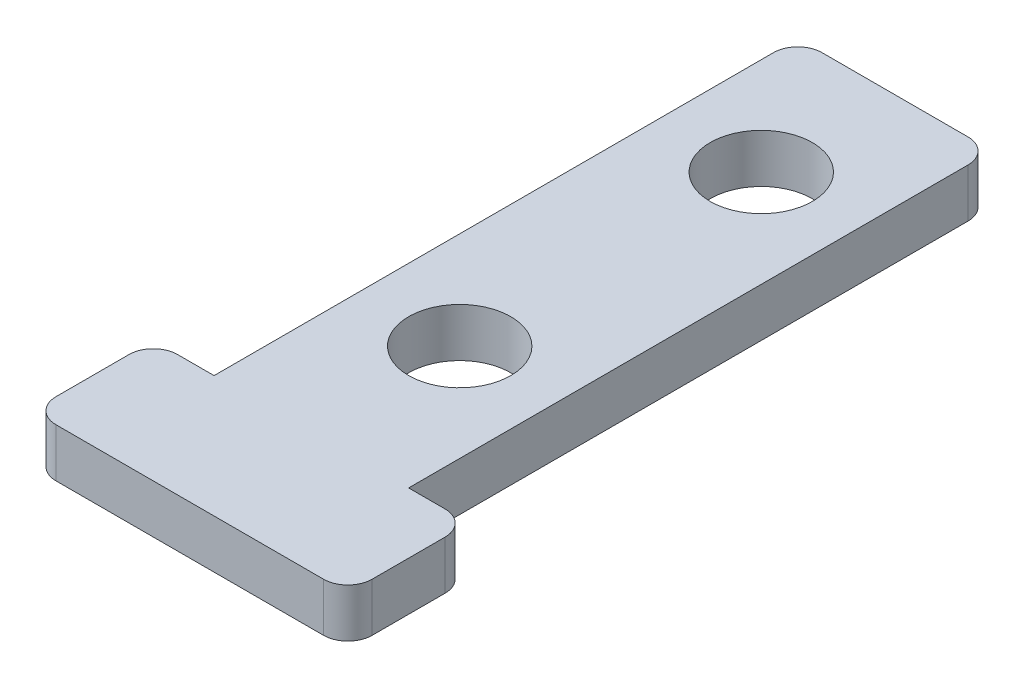
ISO-10303-21;
HEADER;
FILE_DESCRIPTION(('STEP AP214'),'2;1');
FILE_NAME('part.step','',(''),(''),'','','');
FILE_SCHEMA(('AUTOMOTIVE_DESIGN { 1 0 10303 214 1 1 1 1 }'));
ENDSEC;
DATA;
#1=APPLICATION_CONTEXT('core data for automotive mechanical design processes');
#2=APPLICATION_PROTOCOL_DEFINITION('international standard','automotive_design',2000,#1);
#3=PRODUCT_CONTEXT('',#1,'mechanical');
#4=PRODUCT('Part','Part','',(#3));
#5=PRODUCT_RELATED_PRODUCT_CATEGORY('part','',(#4));
#6=PRODUCT_DEFINITION_FORMATION('','',#4);
#7=PRODUCT_DEFINITION_CONTEXT('part definition',#1,'design');
#8=PRODUCT_DEFINITION('design','',#6,#7);
#9=PRODUCT_DEFINITION_SHAPE('','',#8);
#10=(LENGTH_UNIT() NAMED_UNIT(*) SI_UNIT(.MILLI.,.METRE.));
#11=(NAMED_UNIT(*) PLANE_ANGLE_UNIT() SI_UNIT($,.RADIAN.));
#12=(NAMED_UNIT(*) SI_UNIT($,.STERADIAN.) SOLID_ANGLE_UNIT());
#13=UNCERTAINTY_MEASURE_WITH_UNIT(LENGTH_MEASURE(1.E-05),#10,'distance_accuracy_value','');
#14=(GEOMETRIC_REPRESENTATION_CONTEXT(3) GLOBAL_UNCERTAINTY_ASSIGNED_CONTEXT((#13)) GLOBAL_UNIT_ASSIGNED_CONTEXT((#10,
#11,#12)) REPRESENTATION_CONTEXT('',''));
#15=CARTESIAN_POINT('',(0.,0.,0.));
#16=DIRECTION('',(0.,0.,1.));
#17=DIRECTION('',(1.,0.,0.));
#18=AXIS2_PLACEMENT_3D('',#15,#16,#17);
#19=CARTESIAN_POINT('',(0.,2.,0.));
#20=DIRECTION('',(0.,1.,0.));
#21=DIRECTION('',(0.,0.,1.));
#22=AXIS2_PLACEMENT_3D('',#19,#20,#21);
#23=PLANE('',#22);
#24=CARTESIAN_POINT('',(0.,2.,-23.5));
#25=DIRECTION('',(0.,1.,0.));
#26=DIRECTION('',(0.,0.,1.));
#27=AXIS2_PLACEMENT_3D('',#24,#25,#26);
#28=CIRCLE('',#27,2.1);
#29=CARTESIAN_POINT('',(0.,2.,-21.4));
#30=VERTEX_POINT('',#29);
#31=EDGE_CURVE('E229',#30,#30,#28,.T.);
#32=ORIENTED_EDGE('',*,*,#31,.F.);
#33=EDGE_LOOP('',(#32));
#34=FACE_BOUND('',#33,.T.);
#35=DIRECTION('',(0.,0.,-1.));
#36=VECTOR('',#35,1.);
#37=CARTESIAN_POINT('',(4.,2.,-5.));
#38=LINE('',#37,#36);
#39=CARTESIAN_POINT('',(4.,2.,-5.));
#40=VERTEX_POINT('',#39);
#41=CARTESIAN_POINT('',(4.,2.,-28.));
#42=VERTEX_POINT('',#41);
#43=EDGE_CURVE('E187',#40,#42,#38,.T.);
#44=ORIENTED_EDGE('',*,*,#43,.T.);
#45=CARTESIAN_POINT('',(3.,2.,-28.));
#46=DIRECTION('',(0.,1.,0.));
#47=DIRECTION('',(0.,0.,1.));
#48=AXIS2_PLACEMENT_3D('',#45,#46,#47);
#49=CIRCLE('',#48,1.);
#50=CARTESIAN_POINT('',(3.,2.,-29.));
#51=VERTEX_POINT('',#50);
#52=EDGE_CURVE('E12',#42,#51,#49,.T.);
#53=ORIENTED_EDGE('',*,*,#52,.T.);
#54=DIRECTION('',(-1.,0.,0.));
#55=VECTOR('',#54,1.);
#56=CARTESIAN_POINT('',(-4.,2.,-29.));
#57=LINE('',#56,#55);
#58=CARTESIAN_POINT('',(-3.,2.,-29.));
#59=VERTEX_POINT('',#58);
#60=EDGE_CURVE('E209',#51,#59,#57,.T.);
#61=ORIENTED_EDGE('',*,*,#60,.T.);
#62=CARTESIAN_POINT('',(-3.,2.,-28.));
#63=DIRECTION('',(0.,1.,0.));
#64=DIRECTION('',(0.,0.,1.));
#65=AXIS2_PLACEMENT_3D('',#62,#63,#64);
#66=CIRCLE('',#65,1.);
#67=CARTESIAN_POINT('',(-4.,2.,-28.));
#68=VERTEX_POINT('',#67);
#69=EDGE_CURVE('E316',#59,#68,#66,.T.);
#70=ORIENTED_EDGE('',*,*,#69,.T.);
#71=DIRECTION('',(0.,0.,1.));
#72=VECTOR('',#71,1.);
#73=CARTESIAN_POINT('',(-4.,2.,-5.));
#74=LINE('',#73,#72);
#75=CARTESIAN_POINT('',(-4.,2.,-5.));
#76=VERTEX_POINT('',#75);
#77=EDGE_CURVE('E214',#68,#76,#74,.T.);
#78=ORIENTED_EDGE('',*,*,#77,.T.);
#79=DIRECTION('',(-1.,0.,0.));
#80=VECTOR('',#79,1.);
#81=CARTESIAN_POINT('',(-6.5,2.,-5.));
#82=LINE('',#81,#80);
#83=CARTESIAN_POINT('',(-5.5,2.,-5.));
#84=VERTEX_POINT('',#83);
#85=EDGE_CURVE('E303',#76,#84,#82,.T.);
#86=ORIENTED_EDGE('',*,*,#85,.T.);
#87=CARTESIAN_POINT('',(-5.5,2.,-4.));
#88=DIRECTION('',(0.,1.,0.));
#89=DIRECTION('',(0.,0.,1.));
#90=AXIS2_PLACEMENT_3D('',#87,#88,#89);
#91=CIRCLE('',#90,1.);
#92=CARTESIAN_POINT('',(-6.5,2.,-4.));
#93=VERTEX_POINT('',#92);
#94=EDGE_CURVE('E331',#84,#93,#91,.T.);
#95=ORIENTED_EDGE('',*,*,#94,.T.);
#96=DIRECTION('',(0.,0.,1.));
#97=VECTOR('',#96,1.);
#98=CARTESIAN_POINT('',(-6.5,2.,0.));
#99=LINE('',#98,#97);
#100=CARTESIAN_POINT('',(-6.5,2.,-1.));
#101=VERTEX_POINT('',#100);
#102=EDGE_CURVE('E276',#93,#101,#99,.T.);
#103=ORIENTED_EDGE('',*,*,#102,.T.);
#104=CARTESIAN_POINT('',(-5.5,2.,-1.));
#105=DIRECTION('',(0.,1.,0.));
#106=DIRECTION('',(0.,0.,1.));
#107=AXIS2_PLACEMENT_3D('',#104,#105,#106);
#108=CIRCLE('',#107,1.);
#109=CARTESIAN_POINT('',(-5.5,2.,0.));
#110=VERTEX_POINT('',#109);
#111=EDGE_CURVE('E359',#101,#110,#108,.T.);
#112=ORIENTED_EDGE('',*,*,#111,.T.);
#113=DIRECTION('',(1.,0.,0.));
#114=VECTOR('',#113,1.);
#115=CARTESIAN_POINT('',(-6.5,2.,0.));
#116=LINE('',#115,#114);
#117=CARTESIAN_POINT('',(5.5,2.,0.));
#118=VERTEX_POINT('',#117);
#119=EDGE_CURVE('E271',#110,#118,#116,.T.);
#120=ORIENTED_EDGE('',*,*,#119,.T.);
#121=CARTESIAN_POINT('',(5.5,2.,-1.));
#122=DIRECTION('',(0.,1.,0.));
#123=DIRECTION('',(0.,0.,1.));
#124=AXIS2_PLACEMENT_3D('',#121,#122,#123);
#125=CIRCLE('',#124,1.);
#126=CARTESIAN_POINT('',(6.5,2.,-1.));
#127=VERTEX_POINT('',#126);
#128=EDGE_CURVE('E375',#118,#127,#125,.T.);
#129=ORIENTED_EDGE('',*,*,#128,.T.);
#130=DIRECTION('',(0.,0.,-1.));
#131=VECTOR('',#130,1.);
#132=CARTESIAN_POINT('',(6.5,2.,0.));
#133=LINE('',#132,#131);
#134=CARTESIAN_POINT('',(6.5,2.,-4.));
#135=VERTEX_POINT('',#134);
#136=EDGE_CURVE('E196',#127,#135,#133,.T.);
#137=ORIENTED_EDGE('',*,*,#136,.T.);
#138=CARTESIAN_POINT('',(5.5,2.,-4.));
#139=DIRECTION('',(0.,1.,0.));
#140=DIRECTION('',(0.,0.,1.));
#141=AXIS2_PLACEMENT_3D('',#138,#139,#140);
#142=CIRCLE('',#141,1.);
#143=CARTESIAN_POINT('',(5.5,2.,-5.));
#144=VERTEX_POINT('',#143);
#145=EDGE_CURVE('E191',#135,#144,#142,.T.);
#146=ORIENTED_EDGE('',*,*,#145,.T.);
#147=DIRECTION('',(-1.,0.,0.));
#148=VECTOR('',#147,1.);
#149=CARTESIAN_POINT('',(6.5,2.,-5.));
#150=LINE('',#149,#148);
#151=EDGE_CURVE('E184',#144,#40,#150,.T.);
#152=ORIENTED_EDGE('',*,*,#151,.T.);
#153=EDGE_LOOP('',(#44,#53,#61,#70,#78,#86,#95,#103,#112,#120,#129,#137,#146,#152));
#154=FACE_BOUND('',#153,.T.);
#155=CARTESIAN_POINT('',(0.,2.,-11.1));
#156=DIRECTION('',(0.,1.,0.));
#157=DIRECTION('',(0.,0.,1.));
#158=AXIS2_PLACEMENT_3D('',#155,#156,#157);
#159=CIRCLE('',#158,2.1);
#160=CARTESIAN_POINT('',(0.,2.,-9.));
#161=VERTEX_POINT('',#160);
#162=EDGE_CURVE('E242',#161,#161,#159,.T.);
#163=ORIENTED_EDGE('',*,*,#162,.F.);
#164=EDGE_LOOP('',(#163));
#165=FACE_BOUND('',#164,.T.);
#166=ADVANCED_FACE('F53',(#34,#154,#165),#23,.T.);
#167=CARTESIAN_POINT('',(0.,0.,0.));
#168=DIRECTION('',(0.,1.,0.));
#169=DIRECTION('',(0.,0.,1.));
#170=AXIS2_PLACEMENT_3D('',#167,#168,#169);
#171=PLANE('',#170);
#172=DIRECTION('',(-1.,0.,0.));
#173=VECTOR('',#172,1.);
#174=CARTESIAN_POINT('',(-4.,0.,-29.));
#175=LINE('',#174,#173);
#176=CARTESIAN_POINT('',(3.,0.,-29.));
#177=VERTEX_POINT('',#176);
#178=CARTESIAN_POINT('',(-3.,0.,-29.));
#179=VERTEX_POINT('',#178);
#180=EDGE_CURVE('E292',#177,#179,#175,.T.);
#181=ORIENTED_EDGE('',*,*,#180,.F.);
#182=CARTESIAN_POINT('',(3.,0.,-28.));
#183=DIRECTION('',(0.,1.,0.));
#184=DIRECTION('',(0.,0.,1.));
#185=AXIS2_PLACEMENT_3D('',#182,#183,#184);
#186=CIRCLE('',#185,1.);
#187=CARTESIAN_POINT('',(4.,0.,-28.));
#188=VERTEX_POINT('',#187);
#189=EDGE_CURVE('E82',#177,#188,#186,.F.);
#190=ORIENTED_EDGE('',*,*,#189,.T.);
#191=DIRECTION('',(0.,0.,-1.));
#192=VECTOR('',#191,1.);
#193=CARTESIAN_POINT('',(4.,0.,-5.));
#194=LINE('',#193,#192);
#195=CARTESIAN_POINT('',(4.,0.,-5.));
#196=VERTEX_POINT('',#195);
#197=EDGE_CURVE('E502',#196,#188,#194,.T.);
#198=ORIENTED_EDGE('',*,*,#197,.F.);
#199=DIRECTION('',(-1.,0.,0.));
#200=VECTOR('',#199,1.);
#201=CARTESIAN_POINT('',(6.5,0.,-5.));
#202=LINE('',#201,#200);
#203=CARTESIAN_POINT('',(5.5,0.,-5.));
#204=VERTEX_POINT('',#203);
#205=EDGE_CURVE('E202',#204,#196,#202,.T.);
#206=ORIENTED_EDGE('',*,*,#205,.F.);
#207=CARTESIAN_POINT('',(5.5,0.,-4.));
#208=DIRECTION('',(0.,1.,0.));
#209=DIRECTION('',(0.,0.,1.));
#210=AXIS2_PLACEMENT_3D('',#207,#208,#209);
#211=CIRCLE('',#210,1.);
#212=CARTESIAN_POINT('',(6.5,0.,-4.));
#213=VERTEX_POINT('',#212);
#214=EDGE_CURVE('E374',#204,#213,#211,.F.);
#215=ORIENTED_EDGE('',*,*,#214,.T.);
#216=DIRECTION('',(0.,0.,-1.));
#217=VECTOR('',#216,1.);
#218=CARTESIAN_POINT('',(6.5,0.,0.));
#219=LINE('',#218,#217);
#220=CARTESIAN_POINT('',(6.5,0.,-1.));
#221=VERTEX_POINT('',#220);
#222=EDGE_CURVE('E234',#221,#213,#219,.T.);
#223=ORIENTED_EDGE('',*,*,#222,.F.);
#224=CARTESIAN_POINT('',(5.5,0.,-1.));
#225=DIRECTION('',(0.,1.,0.));
#226=DIRECTION('',(0.,0.,1.));
#227=AXIS2_PLACEMENT_3D('',#224,#225,#226);
#228=CIRCLE('',#227,1.);
#229=CARTESIAN_POINT('',(5.5,0.,0.));
#230=VERTEX_POINT('',#229);
#231=EDGE_CURVE('E413',#221,#230,#228,.F.);
#232=ORIENTED_EDGE('',*,*,#231,.T.);
#233=DIRECTION('',(1.,0.,0.));
#234=VECTOR('',#233,1.);
#235=CARTESIAN_POINT('',(-6.5,0.,0.));
#236=LINE('',#235,#234);
#237=CARTESIAN_POINT('',(-5.5,0.,0.));
#238=VERTEX_POINT('',#237);
#239=EDGE_CURVE('E245',#238,#230,#236,.T.);
#240=ORIENTED_EDGE('',*,*,#239,.F.);
#241=CARTESIAN_POINT('',(-5.5,0.,-1.));
#242=DIRECTION('',(0.,1.,0.));
#243=DIRECTION('',(0.,0.,1.));
#244=AXIS2_PLACEMENT_3D('',#241,#242,#243);
#245=CIRCLE('',#244,1.);
#246=CARTESIAN_POINT('',(-6.5,0.,-1.));
#247=VERTEX_POINT('',#246);
#248=EDGE_CURVE('E387',#238,#247,#245,.F.);
#249=ORIENTED_EDGE('',*,*,#248,.T.);
#250=DIRECTION('',(0.,0.,1.));
#251=VECTOR('',#250,1.);
#252=CARTESIAN_POINT('',(-6.5,0.,0.));
#253=LINE('',#252,#251);
#254=CARTESIAN_POINT('',(-6.5,0.,-4.));
#255=VERTEX_POINT('',#254);
#256=EDGE_CURVE('E250',#255,#247,#253,.T.);
#257=ORIENTED_EDGE('',*,*,#256,.F.);
#258=CARTESIAN_POINT('',(-5.5,0.,-4.));
#259=DIRECTION('',(0.,1.,0.));
#260=DIRECTION('',(0.,0.,1.));
#261=AXIS2_PLACEMENT_3D('',#258,#259,#260);
#262=CIRCLE('',#261,1.);
#263=CARTESIAN_POINT('',(-5.5,0.,-5.));
#264=VERTEX_POINT('',#263);
#265=EDGE_CURVE('E332',#255,#264,#262,.F.);
#266=ORIENTED_EDGE('',*,*,#265,.T.);
#267=DIRECTION('',(-1.,0.,0.));
#268=VECTOR('',#267,1.);
#269=CARTESIAN_POINT('',(-6.5,0.,-5.));
#270=LINE('',#269,#268);
#271=CARTESIAN_POINT('',(-4.,0.,-5.));
#272=VERTEX_POINT('',#271);
#273=EDGE_CURVE('E260',#272,#264,#270,.T.);
#274=ORIENTED_EDGE('',*,*,#273,.F.);
#275=DIRECTION('',(0.,0.,1.));
#276=VECTOR('',#275,1.);
#277=CARTESIAN_POINT('',(-4.,0.,-5.));
#278=LINE('',#277,#276);
#279=CARTESIAN_POINT('',(-4.,0.,-28.));
#280=VERTEX_POINT('',#279);
#281=EDGE_CURVE('E288',#280,#272,#278,.T.);
#282=ORIENTED_EDGE('',*,*,#281,.F.);
#283=CARTESIAN_POINT('',(-3.,0.,-28.));
#284=DIRECTION('',(0.,1.,0.));
#285=DIRECTION('',(0.,0.,1.));
#286=AXIS2_PLACEMENT_3D('',#283,#284,#285);
#287=CIRCLE('',#286,1.);
#288=EDGE_CURVE('E456',#280,#179,#287,.F.);
#289=ORIENTED_EDGE('',*,*,#288,.T.);
#290=EDGE_LOOP('',(#181,#190,#198,#206,#215,#223,#232,#240,#249,#257,#266,#274,#282,#289));
#291=FACE_BOUND('',#290,.T.);
#292=CARTESIAN_POINT('',(0.,0.,-23.5));
#293=DIRECTION('',(0.,1.,0.));
#294=DIRECTION('',(0.,0.,1.));
#295=AXIS2_PLACEMENT_3D('',#292,#293,#294);
#296=CIRCLE('',#295,2.1);
#297=CARTESIAN_POINT('',(0.,0.,-21.4));
#298=VERTEX_POINT('',#297);
#299=EDGE_CURVE('E235',#298,#298,#296,.T.);
#300=ORIENTED_EDGE('',*,*,#299,.T.);
#301=EDGE_LOOP('',(#300));
#302=FACE_BOUND('',#301,.T.);
#303=CARTESIAN_POINT('',(0.,0.,-11.1));
#304=DIRECTION('',(0.,1.,0.));
#305=DIRECTION('',(0.,0.,1.));
#306=AXIS2_PLACEMENT_3D('',#303,#304,#305);
#307=CIRCLE('',#306,2.1);
#308=CARTESIAN_POINT('',(0.,0.,-9.));
#309=VERTEX_POINT('',#308);
#310=EDGE_CURVE('E236',#309,#309,#307,.T.);
#311=ORIENTED_EDGE('',*,*,#310,.T.);
#312=EDGE_LOOP('',(#311));
#313=FACE_BOUND('',#312,.T.);
#314=ADVANCED_FACE('F533',(#291,#302,#313),#171,.F.);
#315=CARTESIAN_POINT('',(6.5,2.,0.));
#316=DIRECTION('',(-1.,0.,0.));
#317=DIRECTION('',(0.,0.,1.));
#318=AXIS2_PLACEMENT_3D('',#315,#316,#317);
#319=PLANE('',#318);
#320=ORIENTED_EDGE('',*,*,#222,.T.);
#321=DIRECTION('',(0.,-1.,0.));
#322=VECTOR('',#321,1.);
#323=CARTESIAN_POINT('',(6.5,2.,-4.));
#324=LINE('',#323,#322);
#325=EDGE_CURVE('E380',#213,#135,#324,.F.);
#326=ORIENTED_EDGE('',*,*,#325,.T.);
#327=ORIENTED_EDGE('',*,*,#136,.F.);
#328=DIRECTION('',(0.,-1.,0.));
#329=VECTOR('',#328,1.);
#330=CARTESIAN_POINT('',(6.5,2.,-1.));
#331=LINE('',#330,#329);
#332=EDGE_CURVE('E204',#127,#221,#331,.T.);
#333=ORIENTED_EDGE('',*,*,#332,.T.);
#334=EDGE_LOOP('',(#320,#326,#327,#333));
#335=FACE_BOUND('',#334,.T.);
#336=ADVANCED_FACE('F551',(#335),#319,.F.);
#337=CARTESIAN_POINT('',(6.5,2.,-5.));
#338=DIRECTION('',(0.,0.,1.));
#339=DIRECTION('',(1.,0.,0.));
#340=AXIS2_PLACEMENT_3D('',#337,#338,#339);
#341=PLANE('',#340);
#342=ORIENTED_EDGE('',*,*,#151,.F.);
#343=DIRECTION('',(0.,-1.,0.));
#344=VECTOR('',#343,1.);
#345=CARTESIAN_POINT('',(5.5,2.,-5.));
#346=LINE('',#345,#344);
#347=EDGE_CURVE('E370',#144,#204,#346,.T.);
#348=ORIENTED_EDGE('',*,*,#347,.T.);
#349=ORIENTED_EDGE('',*,*,#205,.T.);
#350=DIRECTION('',(0.,-1.,0.));
#351=VECTOR('',#350,1.);
#352=CARTESIAN_POINT('',(4.,2.,-5.));
#353=LINE('',#352,#351);
#354=EDGE_CURVE('E199',#40,#196,#353,.T.);
#355=ORIENTED_EDGE('',*,*,#354,.F.);
#356=EDGE_LOOP('',(#342,#348,#349,#355));
#357=FACE_BOUND('',#356,.T.);
#358=ADVANCED_FACE('F200',(#357),#341,.F.);
#359=CARTESIAN_POINT('',(4.,2.,-5.));
#360=DIRECTION('',(-1.,0.,0.));
#361=DIRECTION('',(0.,0.,1.));
#362=AXIS2_PLACEMENT_3D('',#359,#360,#361);
#363=PLANE('',#362);
#364=ORIENTED_EDGE('',*,*,#197,.T.);
#365=DIRECTION('',(0.,-1.,0.));
#366=VECTOR('',#365,1.);
#367=CARTESIAN_POINT('',(4.,2.,-28.));
#368=LINE('',#367,#366);
#369=EDGE_CURVE('E64',#188,#42,#368,.F.);
#370=ORIENTED_EDGE('',*,*,#369,.T.);
#371=ORIENTED_EDGE('',*,*,#43,.F.);
#372=ORIENTED_EDGE('',*,*,#354,.T.);
#373=EDGE_LOOP('',(#364,#370,#371,#372));
#374=FACE_BOUND('',#373,.T.);
#375=ADVANCED_FACE('F207',(#374),#363,.F.);
#376=CARTESIAN_POINT('',(-4.,2.,-29.));
#377=DIRECTION('',(0.,0.,1.));
#378=DIRECTION('',(1.,0.,0.));
#379=AXIS2_PLACEMENT_3D('',#376,#377,#378);
#380=PLANE('',#379);
#381=ORIENTED_EDGE('',*,*,#60,.F.);
#382=DIRECTION('',(0.,-1.,0.));
#383=VECTOR('',#382,1.);
#384=CARTESIAN_POINT('',(3.,2.,-29.));
#385=LINE('',#384,#383);
#386=EDGE_CURVE('E470',#51,#177,#385,.T.);
#387=ORIENTED_EDGE('',*,*,#386,.T.);
#388=ORIENTED_EDGE('',*,*,#180,.T.);
#389=DIRECTION('',(0.,-1.,0.));
#390=VECTOR('',#389,1.);
#391=CARTESIAN_POINT('',(-3.,2.,-29.));
#392=LINE('',#391,#390);
#393=EDGE_CURVE('E461',#179,#59,#392,.F.);
#394=ORIENTED_EDGE('',*,*,#393,.T.);
#395=EDGE_LOOP('',(#381,#387,#388,#394));
#396=FACE_BOUND('',#395,.T.);
#397=ADVANCED_FACE('F529',(#396),#380,.F.);
#398=CARTESIAN_POINT('',(-4.,2.,-5.));
#399=DIRECTION('',(1.,0.,0.));
#400=DIRECTION('',(0.,0.,-1.));
#401=AXIS2_PLACEMENT_3D('',#398,#399,#400);
#402=PLANE('',#401);
#403=ORIENTED_EDGE('',*,*,#77,.F.);
#404=DIRECTION('',(0.,-1.,0.));
#405=VECTOR('',#404,1.);
#406=CARTESIAN_POINT('',(-4.,2.,-28.));
#407=LINE('',#406,#405);
#408=EDGE_CURVE('E338',#68,#280,#407,.T.);
#409=ORIENTED_EDGE('',*,*,#408,.T.);
#410=ORIENTED_EDGE('',*,*,#281,.T.);
#411=DIRECTION('',(0.,-1.,0.));
#412=VECTOR('',#411,1.);
#413=CARTESIAN_POINT('',(-4.,2.,-5.));
#414=LINE('',#413,#412);
#415=EDGE_CURVE('E205',#76,#272,#414,.T.);
#416=ORIENTED_EDGE('',*,*,#415,.F.);
#417=EDGE_LOOP('',(#403,#409,#410,#416));
#418=FACE_BOUND('',#417,.T.);
#419=ADVANCED_FACE('F321',(#418),#402,.F.);
#420=CARTESIAN_POINT('',(-6.5,2.,-5.));
#421=DIRECTION('',(0.,0.,1.));
#422=DIRECTION('',(1.,0.,0.));
#423=AXIS2_PLACEMENT_3D('',#420,#421,#422);
#424=PLANE('',#423);
#425=ORIENTED_EDGE('',*,*,#273,.T.);
#426=DIRECTION('',(0.,-1.,0.));
#427=VECTOR('',#426,1.);
#428=CARTESIAN_POINT('',(-5.5,2.,-5.));
#429=LINE('',#428,#427);
#430=EDGE_CURVE('E328',#264,#84,#429,.F.);
#431=ORIENTED_EDGE('',*,*,#430,.T.);
#432=ORIENTED_EDGE('',*,*,#85,.F.);
#433=ORIENTED_EDGE('',*,*,#415,.T.);
#434=EDGE_LOOP('',(#425,#431,#432,#433));
#435=FACE_BOUND('',#434,.T.);
#436=ADVANCED_FACE('F326',(#435),#424,.F.);
#437=CARTESIAN_POINT('',(-6.5,2.,0.));
#438=DIRECTION('',(1.,0.,0.));
#439=DIRECTION('',(0.,0.,-1.));
#440=AXIS2_PLACEMENT_3D('',#437,#438,#439);
#441=PLANE('',#440);
#442=ORIENTED_EDGE('',*,*,#102,.F.);
#443=DIRECTION('',(0.,-1.,0.));
#444=VECTOR('',#443,1.);
#445=CARTESIAN_POINT('',(-6.5,2.,-4.));
#446=LINE('',#445,#444);
#447=EDGE_CURVE('E340',#93,#255,#446,.T.);
#448=ORIENTED_EDGE('',*,*,#447,.T.);
#449=ORIENTED_EDGE('',*,*,#256,.T.);
#450=DIRECTION('',(0.,-1.,0.));
#451=VECTOR('',#450,1.);
#452=CARTESIAN_POINT('',(-6.5,2.,-1.));
#453=LINE('',#452,#451);
#454=EDGE_CURVE('E363',#247,#101,#453,.F.);
#455=ORIENTED_EDGE('',*,*,#454,.T.);
#456=EDGE_LOOP('',(#442,#448,#449,#455));
#457=FACE_BOUND('',#456,.T.);
#458=ADVANCED_FACE('F401',(#457),#441,.F.);
#459=CARTESIAN_POINT('',(-6.5,2.,0.));
#460=DIRECTION('',(0.,0.,-1.));
#461=DIRECTION('',(-1.,0.,0.));
#462=AXIS2_PLACEMENT_3D('',#459,#460,#461);
#463=PLANE('',#462);
#464=ORIENTED_EDGE('',*,*,#119,.F.);
#465=DIRECTION('',(0.,-1.,0.));
#466=VECTOR('',#465,1.);
#467=CARTESIAN_POINT('',(-5.5,2.,0.));
#468=LINE('',#467,#466);
#469=EDGE_CURVE('E384',#110,#238,#468,.T.);
#470=ORIENTED_EDGE('',*,*,#469,.T.);
#471=ORIENTED_EDGE('',*,*,#239,.T.);
#472=DIRECTION('',(0.,-1.,0.));
#473=VECTOR('',#472,1.);
#474=CARTESIAN_POINT('',(5.5,2.,0.));
#475=LINE('',#474,#473);
#476=EDGE_CURVE('E409',#230,#118,#475,.F.);
#477=ORIENTED_EDGE('',*,*,#476,.T.);
#478=EDGE_LOOP('',(#464,#470,#471,#477));
#479=FACE_BOUND('',#478,.T.);
#480=ADVANCED_FACE('F407',(#479),#463,.F.);
#481=CARTESIAN_POINT('',(0.,2.,-23.5));
#482=DIRECTION('',(0.,-1.,0.));
#483=DIRECTION('',(0.,0.,-1.));
#484=AXIS2_PLACEMENT_3D('',#481,#482,#483);
#485=CYLINDRICAL_SURFACE('',#484,2.1);
#486=ORIENTED_EDGE('',*,*,#31,.T.);
#487=EDGE_LOOP('',(#486));
#488=FACE_BOUND('',#487,.T.);
#489=ORIENTED_EDGE('',*,*,#299,.F.);
#490=EDGE_LOOP('',(#489));
#491=FACE_BOUND('',#490,.T.);
#492=ADVANCED_FACE('F559',(#488,#491),#485,.F.);
#493=CARTESIAN_POINT('',(0.,2.,-11.1));
#494=DIRECTION('',(0.,-1.,0.));
#495=DIRECTION('',(0.,0.,-1.));
#496=AXIS2_PLACEMENT_3D('',#493,#494,#495);
#497=CYLINDRICAL_SURFACE('',#496,2.1);
#498=ORIENTED_EDGE('',*,*,#162,.T.);
#499=EDGE_LOOP('',(#498));
#500=FACE_BOUND('',#499,.T.);
#501=ORIENTED_EDGE('',*,*,#310,.F.);
#502=EDGE_LOOP('',(#501));
#503=FACE_BOUND('',#502,.T.);
#504=ADVANCED_FACE('F591',(#500,#503),#497,.F.);
#505=CARTESIAN_POINT('',(5.5,2.,-1.));
#506=DIRECTION('',(0.,-1.,0.));
#507=DIRECTION('',(0.,0.,-1.));
#508=AXIS2_PLACEMENT_3D('',#505,#506,#507);
#509=CYLINDRICAL_SURFACE('',#508,1.);
#510=ORIENTED_EDGE('',*,*,#128,.F.);
#511=ORIENTED_EDGE('',*,*,#476,.F.);
#512=ORIENTED_EDGE('',*,*,#231,.F.);
#513=ORIENTED_EDGE('',*,*,#332,.F.);
#514=EDGE_LOOP('',(#510,#511,#512,#513));
#515=FACE_BOUND('',#514,.T.);
#516=ADVANCED_FACE('F415',(#515),#509,.T.);
#517=CARTESIAN_POINT('',(5.5,2.,-4.));
#518=DIRECTION('',(0.,-1.,0.));
#519=DIRECTION('',(0.,0.,-1.));
#520=AXIS2_PLACEMENT_3D('',#517,#518,#519);
#521=CYLINDRICAL_SURFACE('',#520,1.);
#522=ORIENTED_EDGE('',*,*,#145,.F.);
#523=ORIENTED_EDGE('',*,*,#325,.F.);
#524=ORIENTED_EDGE('',*,*,#214,.F.);
#525=ORIENTED_EDGE('',*,*,#347,.F.);
#526=EDGE_LOOP('',(#522,#523,#524,#525));
#527=FACE_BOUND('',#526,.T.);
#528=ADVANCED_FACE('F542',(#527),#521,.T.);
#529=CARTESIAN_POINT('',(-5.5,2.,-1.));
#530=DIRECTION('',(0.,-1.,0.));
#531=DIRECTION('',(0.,0.,-1.));
#532=AXIS2_PLACEMENT_3D('',#529,#530,#531);
#533=CYLINDRICAL_SURFACE('',#532,1.);
#534=ORIENTED_EDGE('',*,*,#111,.F.);
#535=ORIENTED_EDGE('',*,*,#454,.F.);
#536=ORIENTED_EDGE('',*,*,#248,.F.);
#537=ORIENTED_EDGE('',*,*,#469,.F.);
#538=EDGE_LOOP('',(#534,#535,#536,#537));
#539=FACE_BOUND('',#538,.T.);
#540=ADVANCED_FACE('F405',(#539),#533,.T.);
#541=CARTESIAN_POINT('',(-5.5,2.,-4.));
#542=DIRECTION('',(0.,-1.,0.));
#543=DIRECTION('',(0.,0.,-1.));
#544=AXIS2_PLACEMENT_3D('',#541,#542,#543);
#545=CYLINDRICAL_SURFACE('',#544,1.);
#546=ORIENTED_EDGE('',*,*,#94,.F.);
#547=ORIENTED_EDGE('',*,*,#430,.F.);
#548=ORIENTED_EDGE('',*,*,#265,.F.);
#549=ORIENTED_EDGE('',*,*,#447,.F.);
#550=EDGE_LOOP('',(#546,#547,#548,#549));
#551=FACE_BOUND('',#550,.T.);
#552=ADVANCED_FACE('F535',(#551),#545,.T.);
#553=CARTESIAN_POINT('',(-3.,2.,-28.));
#554=DIRECTION('',(0.,-1.,0.));
#555=DIRECTION('',(0.,0.,-1.));
#556=AXIS2_PLACEMENT_3D('',#553,#554,#555);
#557=CYLINDRICAL_SURFACE('',#556,1.);
#558=ORIENTED_EDGE('',*,*,#69,.F.);
#559=ORIENTED_EDGE('',*,*,#393,.F.);
#560=ORIENTED_EDGE('',*,*,#288,.F.);
#561=ORIENTED_EDGE('',*,*,#408,.F.);
#562=EDGE_LOOP('',(#558,#559,#560,#561));
#563=FACE_BOUND('',#562,.T.);
#564=ADVANCED_FACE('F532',(#563),#557,.T.);
#565=CARTESIAN_POINT('',(3.,2.,-28.));
#566=DIRECTION('',(0.,-1.,0.));
#567=DIRECTION('',(0.,0.,-1.));
#568=AXIS2_PLACEMENT_3D('',#565,#566,#567);
#569=CYLINDRICAL_SURFACE('',#568,1.);
#570=ORIENTED_EDGE('',*,*,#52,.F.);
#571=ORIENTED_EDGE('',*,*,#369,.F.);
#572=ORIENTED_EDGE('',*,*,#189,.F.);
#573=ORIENTED_EDGE('',*,*,#386,.F.);
#574=EDGE_LOOP('',(#570,#571,#572,#573));
#575=FACE_BOUND('',#574,.T.);
#576=ADVANCED_FACE('F56',(#575),#569,.T.);
#577=CLOSED_SHELL('',(#166,#314,#336,#358,#375,#397,#419,#436,#458,#480,#492,#504,#516,#528,
#540,#552,#564,#576));
#578=MANIFOLD_SOLID_BREP('B2',#577);
#579=ADVANCED_BREP_SHAPE_REPRESENTATION('',(#18,#578),#14);
#580=SHAPE_DEFINITION_REPRESENTATION(#9,#579);
ENDSEC;
END-ISO-10303-21;
